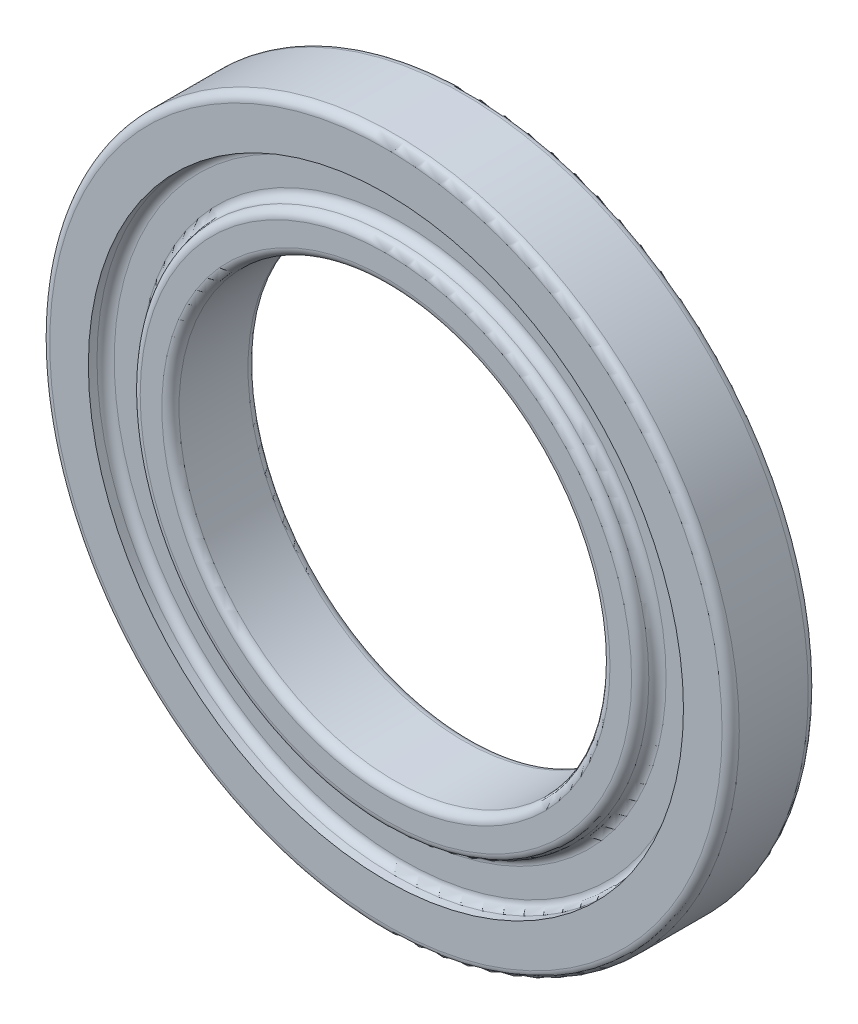
ISO-10303-21;
HEADER;
FILE_DESCRIPTION(('STEP AP214'),'2;1');
FILE_NAME('part.step','',(''),(''),'','','');
FILE_SCHEMA(('AUTOMOTIVE_DESIGN { 1 0 10303 214 1 1 1 1 }'));
ENDSEC;
DATA;
#1=APPLICATION_CONTEXT('core data for automotive mechanical design processes');
#2=APPLICATION_PROTOCOL_DEFINITION('international standard','automotive_design',2000,#1);
#3=PRODUCT_CONTEXT('',#1,'mechanical');
#4=PRODUCT('Part','Part','',(#3));
#5=PRODUCT_RELATED_PRODUCT_CATEGORY('part','',(#4));
#6=PRODUCT_DEFINITION_FORMATION('','',#4);
#7=PRODUCT_DEFINITION_CONTEXT('part definition',#1,'design');
#8=PRODUCT_DEFINITION('design','',#6,#7);
#9=PRODUCT_DEFINITION_SHAPE('','',#8);
#10=(LENGTH_UNIT() NAMED_UNIT(*) SI_UNIT(.MILLI.,.METRE.));
#11=(NAMED_UNIT(*) PLANE_ANGLE_UNIT() SI_UNIT($,.RADIAN.));
#12=(NAMED_UNIT(*) SI_UNIT($,.STERADIAN.) SOLID_ANGLE_UNIT());
#13=UNCERTAINTY_MEASURE_WITH_UNIT(LENGTH_MEASURE(1.E-05),#10,'distance_accuracy_value','');
#14=(GEOMETRIC_REPRESENTATION_CONTEXT(3) GLOBAL_UNCERTAINTY_ASSIGNED_CONTEXT((#13)) GLOBAL_UNIT_ASSIGNED_CONTEXT((#10,
#11,#12)) REPRESENTATION_CONTEXT('',''));
#15=CARTESIAN_POINT('',(0.,0.,0.));
#16=DIRECTION('',(0.,0.,1.));
#17=DIRECTION('',(1.,0.,0.));
#18=AXIS2_PLACEMENT_3D('',#15,#16,#17);
#19=CARTESIAN_POINT('',(0.,0.,-0.05));
#20=DIRECTION('',(0.,0.,1.));
#21=DIRECTION('',(1.,0.,0.));
#22=AXIS2_PLACEMENT_3D('',#19,#20,#21);
#23=PLANE('',#22);
#24=CARTESIAN_POINT('',(0.,0.,-0.05));
#25=DIRECTION('',(0.,0.,1.));
#26=DIRECTION('',(1.,0.,0.));
#27=AXIS2_PLACEMENT_3D('',#24,#25,#26);
#28=CIRCLE('',#27,0.26);
#29=CARTESIAN_POINT('',(0.26,0.,-0.05));
#30=VERTEX_POINT('',#29);
#31=EDGE_CURVE('E46',#30,#30,#28,.T.);
#32=ORIENTED_EDGE('',*,*,#31,.T.);
#33=EDGE_LOOP('',(#32));
#34=FACE_BOUND('',#33,.T.);
#35=CARTESIAN_POINT('',(0.,0.,-0.05));
#36=DIRECTION('',(0.,0.,1.));
#37=DIRECTION('',(1.,0.,0.));
#38=AXIS2_PLACEMENT_3D('',#35,#36,#37);
#39=CIRCLE('',#38,0.285065169706693);
#40=CARTESIAN_POINT('',(0.285065169706693,0.,-0.05));
#41=VERTEX_POINT('',#40);
#42=EDGE_CURVE('E73',#41,#41,#39,.F.);
#43=ORIENTED_EDGE('',*,*,#42,.T.);
#44=EDGE_LOOP('',(#43));
#45=FACE_BOUND('',#44,.T.);
#46=ADVANCED_FACE('F31',(#34,#45),#23,.F.);
#47=CARTESIAN_POINT('',(0.,0.,0.05));
#48=DIRECTION('',(0.,0.,1.));
#49=DIRECTION('',(1.,0.,0.));
#50=AXIS2_PLACEMENT_3D('',#47,#48,#49);
#51=PLANE('',#50);
#52=CARTESIAN_POINT('',(0.,0.,0.05));
#53=DIRECTION('',(0.,0.,1.));
#54=DIRECTION('',(1.,0.,0.));
#55=AXIS2_PLACEMENT_3D('',#52,#53,#54);
#56=CIRCLE('',#55,0.26);
#57=CARTESIAN_POINT('',(0.26,0.,0.05));
#58=VERTEX_POINT('',#57);
#59=EDGE_CURVE('E10',#58,#58,#56,.F.);
#60=ORIENTED_EDGE('',*,*,#59,.T.);
#61=EDGE_LOOP('',(#60));
#62=FACE_BOUND('',#61,.T.);
#63=CARTESIAN_POINT('',(0.,0.,0.05));
#64=DIRECTION('',(0.,0.,1.));
#65=DIRECTION('',(1.,0.,0.));
#66=AXIS2_PLACEMENT_3D('',#63,#64,#65);
#67=CIRCLE('',#66,0.285065169706693);
#68=CARTESIAN_POINT('',(0.285065169706693,0.,0.05));
#69=VERTEX_POINT('',#68);
#70=EDGE_CURVE('E51',#69,#69,#67,.T.);
#71=ORIENTED_EDGE('',*,*,#70,.T.);
#72=EDGE_LOOP('',(#71));
#73=FACE_BOUND('',#72,.T.);
#74=ADVANCED_FACE('F120',(#62,#73),#51,.T.);
#75=CARTESIAN_POINT('',(0.,0.,0.05));
#76=DIRECTION('',(0.,0.,1.));
#77=DIRECTION('',(1.,0.,0.));
#78=AXIS2_PLACEMENT_3D('',#75,#76,#77);
#79=CIRCLE('',#78,0.39);
#80=CARTESIAN_POINT('',(0.39,0.,0.05));
#81=VERTEX_POINT('',#80);
#82=EDGE_CURVE('E61',#81,#81,#79,.T.);
#83=ORIENTED_EDGE('',*,*,#82,.T.);
#84=EDGE_LOOP('',(#83));
#85=FACE_BOUND('',#84,.T.);
#86=CARTESIAN_POINT('',(0.,0.,0.05));
#87=DIRECTION('',(0.,0.,1.));
#88=DIRECTION('',(1.,0.,0.));
#89=AXIS2_PLACEMENT_3D('',#86,#87,#88);
#90=CIRCLE('',#89,0.345218632127944);
#91=CARTESIAN_POINT('',(0.345218632127944,0.,0.05));
#92=VERTEX_POINT('',#91);
#93=EDGE_CURVE('E94',#92,#92,#90,.T.);
#94=ORIENTED_EDGE('',*,*,#93,.F.);
#95=EDGE_LOOP('',(#94));
#96=FACE_BOUND('',#95,.T.);
#97=ADVANCED_FACE('F126',(#85,#96),#51,.T.);
#98=CARTESIAN_POINT('',(0.,0.,-0.05));
#99=DIRECTION('',(0.,0.,1.));
#100=DIRECTION('',(1.,0.,0.));
#101=AXIS2_PLACEMENT_3D('',#98,#99,#100);
#102=CIRCLE('',#101,0.39);
#103=CARTESIAN_POINT('',(0.39,0.,-0.05));
#104=VERTEX_POINT('',#103);
#105=EDGE_CURVE('E64',#104,#104,#102,.F.);
#106=ORIENTED_EDGE('',*,*,#105,.T.);
#107=EDGE_LOOP('',(#106));
#108=FACE_BOUND('',#107,.T.);
#109=CARTESIAN_POINT('',(0.,0.,-0.05));
#110=DIRECTION('',(0.,0.,1.));
#111=DIRECTION('',(1.,0.,0.));
#112=AXIS2_PLACEMENT_3D('',#109,#110,#111);
#113=CIRCLE('',#112,0.345218632127944);
#114=CARTESIAN_POINT('',(0.345218632127944,0.,-0.05));
#115=VERTEX_POINT('',#114);
#116=EDGE_CURVE('E58',#115,#115,#113,.T.);
#117=ORIENTED_EDGE('',*,*,#116,.T.);
#118=EDGE_LOOP('',(#117));
#119=FACE_BOUND('',#118,.T.);
#120=ADVANCED_FACE('F100',(#108,#119),#23,.F.);
#121=CARTESIAN_POINT('',(0.,0.,0.05));
#122=DIRECTION('',(0.,0.,-1.));
#123=DIRECTION('',(-1.,0.,0.));
#124=AXIS2_PLACEMENT_3D('',#121,#122,#123);
#125=CYLINDRICAL_SURFACE('',#124,0.4);
#126=CARTESIAN_POINT('',(0.,0.,-0.0400000000000004));
#127=DIRECTION('',(0.,0.,1.));
#128=DIRECTION('',(1.,0.,0.));
#129=AXIS2_PLACEMENT_3D('',#126,#127,#128);
#130=CIRCLE('',#129,0.4);
#131=CARTESIAN_POINT('',(0.4,0.,-0.0400000000000004));
#132=VERTEX_POINT('',#131);
#133=EDGE_CURVE('E67',#132,#132,#130,.T.);
#134=ORIENTED_EDGE('',*,*,#133,.T.);
#135=EDGE_LOOP('',(#134));
#136=FACE_BOUND('',#135,.T.);
#137=CARTESIAN_POINT('',(0.,0.,0.0400000000000004));
#138=DIRECTION('',(0.,0.,1.));
#139=DIRECTION('',(1.,0.,0.));
#140=AXIS2_PLACEMENT_3D('',#137,#138,#139);
#141=CIRCLE('',#140,0.4);
#142=CARTESIAN_POINT('',(0.4,0.,0.0400000000000004));
#143=VERTEX_POINT('',#142);
#144=EDGE_CURVE('E70',#143,#143,#141,.F.);
#145=ORIENTED_EDGE('',*,*,#144,.T.);
#146=EDGE_LOOP('',(#145));
#147=FACE_BOUND('',#146,.T.);
#148=ADVANCED_FACE('F131',(#136,#147),#125,.T.);
#149=CARTESIAN_POINT('',(0.,0.,0.05));
#150=DIRECTION('',(0.,0.,-1.));
#151=DIRECTION('',(-1.,0.,0.));
#152=AXIS2_PLACEMENT_3D('',#149,#150,#151);
#153=CYLINDRICAL_SURFACE('',#152,0.25);
#154=CARTESIAN_POINT('',(0.,0.,-0.0400000000000004));
#155=DIRECTION('',(0.,0.,1.));
#156=DIRECTION('',(1.,0.,0.));
#157=AXIS2_PLACEMENT_3D('',#154,#155,#156);
#158=CIRCLE('',#157,0.25);
#159=CARTESIAN_POINT('',(0.25,0.,-0.0400000000000004));
#160=VERTEX_POINT('',#159);
#161=EDGE_CURVE('E38',#160,#160,#158,.F.);
#162=ORIENTED_EDGE('',*,*,#161,.T.);
#163=EDGE_LOOP('',(#162));
#164=FACE_BOUND('',#163,.T.);
#165=CARTESIAN_POINT('',(0.,0.,0.0400000000000004));
#166=DIRECTION('',(0.,0.,1.));
#167=DIRECTION('',(1.,0.,0.));
#168=AXIS2_PLACEMENT_3D('',#165,#166,#167);
#169=CIRCLE('',#168,0.25);
#170=CARTESIAN_POINT('',(0.25,0.,0.0400000000000004));
#171=VERTEX_POINT('',#170);
#172=EDGE_CURVE('E42',#171,#171,#169,.T.);
#173=ORIENTED_EDGE('',*,*,#172,.T.);
#174=EDGE_LOOP('',(#173));
#175=FACE_BOUND('',#174,.T.);
#176=ADVANCED_FACE('F137',(#164,#175),#153,.F.);
#177=CARTESIAN_POINT('',(0.,0.,0.03));
#178=DIRECTION('',(0.,0.,1.));
#179=DIRECTION('',(1.,0.,0.));
#180=AXIS2_PLACEMENT_3D('',#177,#178,#179);
#181=CYLINDRICAL_SURFACE('',#180,0.345218632127944);
#182=CARTESIAN_POINT('',(0.,0.,0.0399999999999996));
#183=DIRECTION('',(0.,0.,1.));
#184=DIRECTION('',(1.,0.,0.));
#185=AXIS2_PLACEMENT_3D('',#182,#183,#184);
#186=CIRCLE('',#185,0.345218632127944);
#187=CARTESIAN_POINT('',(0.345218632127944,0.,0.0399999999999996));
#188=VERTEX_POINT('',#187);
#189=EDGE_CURVE('E79',#188,#188,#186,.F.);
#190=ORIENTED_EDGE('',*,*,#189,.T.);
#191=EDGE_LOOP('',(#190));
#192=FACE_BOUND('',#191,.T.);
#193=ORIENTED_EDGE('',*,*,#93,.T.);
#194=EDGE_LOOP('',(#193));
#195=FACE_BOUND('',#194,.T.);
#196=ADVANCED_FACE('F160',(#192,#195),#181,.F.);
#197=CARTESIAN_POINT('',(0.,0.,0.03));
#198=DIRECTION('',(0.,0.,1.));
#199=DIRECTION('',(1.,0.,0.));
#200=AXIS2_PLACEMENT_3D('',#197,#198,#199);
#201=PLANE('',#200);
#202=CARTESIAN_POINT('',(0.,0.,0.03));
#203=DIRECTION('',(0.,0.,1.));
#204=DIRECTION('',(1.,0.,0.));
#205=AXIS2_PLACEMENT_3D('',#202,#203,#204);
#206=CIRCLE('',#205,0.305065169706692);
#207=CARTESIAN_POINT('',(0.305065169706692,0.,0.03));
#208=VERTEX_POINT('',#207);
#209=EDGE_CURVE('E82',#208,#208,#206,.F.);
#210=ORIENTED_EDGE('',*,*,#209,.T.);
#211=EDGE_LOOP('',(#210));
#212=FACE_BOUND('',#211,.T.);
#213=CARTESIAN_POINT('',(0.,0.,0.03));
#214=DIRECTION('',(0.,0.,1.));
#215=DIRECTION('',(1.,0.,0.));
#216=AXIS2_PLACEMENT_3D('',#213,#214,#215);
#217=CIRCLE('',#216,0.335218632127944);
#218=CARTESIAN_POINT('',(0.335218632127944,0.,0.03));
#219=VERTEX_POINT('',#218);
#220=EDGE_CURVE('E85',#219,#219,#217,.T.);
#221=ORIENTED_EDGE('',*,*,#220,.T.);
#222=EDGE_LOOP('',(#221));
#223=FACE_BOUND('',#222,.T.);
#224=ADVANCED_FACE('F115',(#212,#223),#201,.T.);
#225=CARTESIAN_POINT('',(0.,0.,-0.03));
#226=DIRECTION('',(0.,0.,-1.));
#227=DIRECTION('',(1.,0.,0.));
#228=AXIS2_PLACEMENT_3D('',#225,#226,#227);
#229=PLANE('',#228);
#230=CARTESIAN_POINT('',(0.,0.,-0.03));
#231=DIRECTION('',(0.,0.,-1.));
#232=DIRECTION('',(-1.,0.,0.));
#233=AXIS2_PLACEMENT_3D('',#230,#231,#232);
#234=CIRCLE('',#233,0.305065169706692);
#235=CARTESIAN_POINT('',(-0.305065169706692,0.,-0.03));
#236=VERTEX_POINT('',#235);
#237=EDGE_CURVE('E88',#236,#236,#234,.F.);
#238=ORIENTED_EDGE('',*,*,#237,.T.);
#239=EDGE_LOOP('',(#238));
#240=FACE_BOUND('',#239,.T.);
#241=CARTESIAN_POINT('',(0.,0.,-0.03));
#242=DIRECTION('',(0.,0.,-1.));
#243=DIRECTION('',(-1.,0.,0.));
#244=AXIS2_PLACEMENT_3D('',#241,#242,#243);
#245=CIRCLE('',#244,0.335218632127944);
#246=CARTESIAN_POINT('',(-0.335218632127944,0.,-0.03));
#247=VERTEX_POINT('',#246);
#248=EDGE_CURVE('E91',#247,#247,#245,.T.);
#249=ORIENTED_EDGE('',*,*,#248,.T.);
#250=EDGE_LOOP('',(#249));
#251=FACE_BOUND('',#250,.T.);
#252=ADVANCED_FACE('F105',(#240,#251),#229,.T.);
#253=CARTESIAN_POINT('',(0.,0.,-0.03));
#254=DIRECTION('',(0.,0.,-1.));
#255=DIRECTION('',(-1.,0.,0.));
#256=AXIS2_PLACEMENT_3D('',#253,#254,#255);
#257=CYLINDRICAL_SURFACE('',#256,0.345218632127944);
#258=CARTESIAN_POINT('',(0.,0.,-0.0399999999999996));
#259=DIRECTION('',(0.,0.,-1.));
#260=DIRECTION('',(-1.,0.,0.));
#261=AXIS2_PLACEMENT_3D('',#258,#259,#260);
#262=CIRCLE('',#261,0.345218632127944);
#263=CARTESIAN_POINT('',(-0.345218632127944,0.,-0.0399999999999996));
#264=VERTEX_POINT('',#263);
#265=EDGE_CURVE('E76',#264,#264,#262,.F.);
#266=ORIENTED_EDGE('',*,*,#265,.T.);
#267=EDGE_LOOP('',(#266));
#268=FACE_BOUND('',#267,.T.);
#269=ORIENTED_EDGE('',*,*,#116,.F.);
#270=EDGE_LOOP('',(#269));
#271=FACE_BOUND('',#270,.T.);
#272=ADVANCED_FACE('F102',(#268,#271),#257,.F.);
#273=CARTESIAN_POINT('',(0.,0.,-0.0400000000000004));
#274=DIRECTION('',(0.,0.,1.));
#275=DIRECTION('',(1.,0.,0.));
#276=AXIS2_PLACEMENT_3D('',#273,#274,#275);
#277=TOROIDAL_SURFACE('',#276,0.285065169706693,0.00999999999999959);
#278=ORIENTED_EDGE('',*,*,#42,.F.);
#279=EDGE_LOOP('',(#278));
#280=FACE_BOUND('',#279,.T.);
#281=CARTESIAN_POINT('',(0.,0.,-0.0400000000000004));
#282=DIRECTION('',(0.,0.,1.));
#283=DIRECTION('',(1.,0.,0.));
#284=AXIS2_PLACEMENT_3D('',#281,#282,#283);
#285=CIRCLE('',#284,0.295065169706692);
#286=CARTESIAN_POINT('',(0.295065169706692,0.,-0.0400000000000004));
#287=VERTEX_POINT('',#286);
#288=EDGE_CURVE('E55',#287,#287,#285,.T.);
#289=ORIENTED_EDGE('',*,*,#288,.F.);
#290=EDGE_LOOP('',(#289));
#291=FACE_BOUND('',#290,.T.);
#292=ADVANCED_FACE('F104',(#280,#291),#277,.T.);
#293=CARTESIAN_POINT('',(0.,0.,-0.0399999999999996));
#294=DIRECTION('',(0.,0.,-1.));
#295=DIRECTION('',(-1.,0.,0.));
#296=AXIS2_PLACEMENT_3D('',#293,#294,#295);
#297=TOROIDAL_SURFACE('',#296,0.305065169706692,0.00999999999999959);
#298=ORIENTED_EDGE('',*,*,#288,.T.);
#299=EDGE_LOOP('',(#298));
#300=FACE_BOUND('',#299,.T.);
#301=ORIENTED_EDGE('',*,*,#237,.F.);
#302=EDGE_LOOP('',(#301));
#303=FACE_BOUND('',#302,.T.);
#304=ADVANCED_FACE('F112',(#300,#303),#297,.F.);
#305=CARTESIAN_POINT('',(0.,0.,0.0400000000000004));
#306=DIRECTION('',(0.,0.,1.));
#307=DIRECTION('',(1.,0.,0.));
#308=AXIS2_PLACEMENT_3D('',#305,#306,#307);
#309=TOROIDAL_SURFACE('',#308,0.285065169706693,0.00999999999999959);
#310=ORIENTED_EDGE('',*,*,#70,.F.);
#311=EDGE_LOOP('',(#310));
#312=FACE_BOUND('',#311,.T.);
#313=CARTESIAN_POINT('',(0.,0.,0.0400000000000004));
#314=DIRECTION('',(0.,0.,1.));
#315=DIRECTION('',(1.,0.,0.));
#316=AXIS2_PLACEMENT_3D('',#313,#314,#315);
#317=CIRCLE('',#316,0.295065169706692);
#318=CARTESIAN_POINT('',(0.295065169706692,0.,0.0400000000000004));
#319=VERTEX_POINT('',#318);
#320=EDGE_CURVE('E52',#319,#319,#317,.F.);
#321=ORIENTED_EDGE('',*,*,#320,.F.);
#322=EDGE_LOOP('',(#321));
#323=FACE_BOUND('',#322,.T.);
#324=ADVANCED_FACE('F185',(#312,#323),#309,.T.);
#325=CARTESIAN_POINT('',(0.,0.,0.0399999999999996));
#326=DIRECTION('',(0.,0.,1.));
#327=DIRECTION('',(1.,0.,0.));
#328=AXIS2_PLACEMENT_3D('',#325,#326,#327);
#329=TOROIDAL_SURFACE('',#328,0.305065169706692,0.00999999999999959);
#330=ORIENTED_EDGE('',*,*,#209,.F.);
#331=EDGE_LOOP('',(#330));
#332=FACE_BOUND('',#331,.T.);
#333=ORIENTED_EDGE('',*,*,#320,.T.);
#334=EDGE_LOOP('',(#333));
#335=FACE_BOUND('',#334,.T.);
#336=ADVANCED_FACE('F175',(#332,#335),#329,.F.);
#337=CARTESIAN_POINT('',(0.,0.,0.0399999999999996));
#338=DIRECTION('',(0.,0.,1.));
#339=DIRECTION('',(1.,0.,0.));
#340=AXIS2_PLACEMENT_3D('',#337,#338,#339);
#341=TOROIDAL_SURFACE('',#340,0.335218632127944,0.00999999999999959);
#342=ORIENTED_EDGE('',*,*,#189,.F.);
#343=EDGE_LOOP('',(#342));
#344=FACE_BOUND('',#343,.T.);
#345=ORIENTED_EDGE('',*,*,#220,.F.);
#346=EDGE_LOOP('',(#345));
#347=FACE_BOUND('',#346,.T.);
#348=ADVANCED_FACE('F172',(#344,#347),#341,.F.);
#349=CARTESIAN_POINT('',(0.,0.,-0.0399999999999996));
#350=DIRECTION('',(0.,0.,-1.));
#351=DIRECTION('',(-1.,0.,0.));
#352=AXIS2_PLACEMENT_3D('',#349,#350,#351);
#353=TOROIDAL_SURFACE('',#352,0.335218632127944,0.00999999999999959);
#354=ORIENTED_EDGE('',*,*,#248,.F.);
#355=EDGE_LOOP('',(#354));
#356=FACE_BOUND('',#355,.T.);
#357=ORIENTED_EDGE('',*,*,#265,.F.);
#358=EDGE_LOOP('',(#357));
#359=FACE_BOUND('',#358,.T.);
#360=ADVANCED_FACE('F146',(#356,#359),#353,.F.);
#361=CARTESIAN_POINT('',(0.,0.,-0.0400000000000004));
#362=DIRECTION('',(0.,0.,1.));
#363=DIRECTION('',(1.,0.,0.));
#364=AXIS2_PLACEMENT_3D('',#361,#362,#363);
#365=TOROIDAL_SURFACE('',#364,0.39,0.00999999999999959);
#366=ORIENTED_EDGE('',*,*,#105,.F.);
#367=EDGE_LOOP('',(#366));
#368=FACE_BOUND('',#367,.T.);
#369=ORIENTED_EDGE('',*,*,#133,.F.);
#370=EDGE_LOOP('',(#369));
#371=FACE_BOUND('',#370,.T.);
#372=ADVANCED_FACE('F142',(#368,#371),#365,.T.);
#373=CARTESIAN_POINT('',(0.,0.,0.0400000000000004));
#374=DIRECTION('',(0.,0.,1.));
#375=DIRECTION('',(1.,0.,0.));
#376=AXIS2_PLACEMENT_3D('',#373,#374,#375);
#377=TOROIDAL_SURFACE('',#376,0.39,0.00999999999999959);
#378=ORIENTED_EDGE('',*,*,#144,.F.);
#379=EDGE_LOOP('',(#378));
#380=FACE_BOUND('',#379,.T.);
#381=ORIENTED_EDGE('',*,*,#82,.F.);
#382=EDGE_LOOP('',(#381));
#383=FACE_BOUND('',#382,.T.);
#384=ADVANCED_FACE('F145',(#380,#383),#377,.T.);
#385=CARTESIAN_POINT('',(0.,0.,-0.0400000000000004));
#386=DIRECTION('',(0.,0.,1.));
#387=DIRECTION('',(1.,0.,0.));
#388=AXIS2_PLACEMENT_3D('',#385,#386,#387);
#389=TOROIDAL_SURFACE('',#388,0.26,0.00999999999999959);
#390=ORIENTED_EDGE('',*,*,#161,.F.);
#391=EDGE_LOOP('',(#390));
#392=FACE_BOUND('',#391,.T.);
#393=ORIENTED_EDGE('',*,*,#31,.F.);
#394=EDGE_LOOP('',(#393));
#395=FACE_BOUND('',#394,.T.);
#396=ADVANCED_FACE('F154',(#392,#395),#389,.T.);
#397=CARTESIAN_POINT('',(0.,0.,0.0400000000000004));
#398=DIRECTION('',(0.,0.,1.));
#399=DIRECTION('',(1.,0.,0.));
#400=AXIS2_PLACEMENT_3D('',#397,#398,#399);
#401=TOROIDAL_SURFACE('',#400,0.26,0.00999999999999959);
#402=ORIENTED_EDGE('',*,*,#59,.F.);
#403=EDGE_LOOP('',(#402));
#404=FACE_BOUND('',#403,.T.);
#405=ORIENTED_EDGE('',*,*,#172,.F.);
#406=EDGE_LOOP('',(#405));
#407=FACE_BOUND('',#406,.T.);
#408=ADVANCED_FACE('F33',(#404,#407),#401,.T.);
#409=CLOSED_SHELL('',(#46,#74,#97,#120,#148,#176,#196,#224,#252,#272,#292,#304,#324,#336,#348,
#360,#372,#384,#396,#408));
#410=MANIFOLD_SOLID_BREP('B2',#409);
#411=ADVANCED_BREP_SHAPE_REPRESENTATION('',(#18,#410),#14);
#412=SHAPE_DEFINITION_REPRESENTATION(#9,#411);
ENDSEC;
END-ISO-10303-21;
